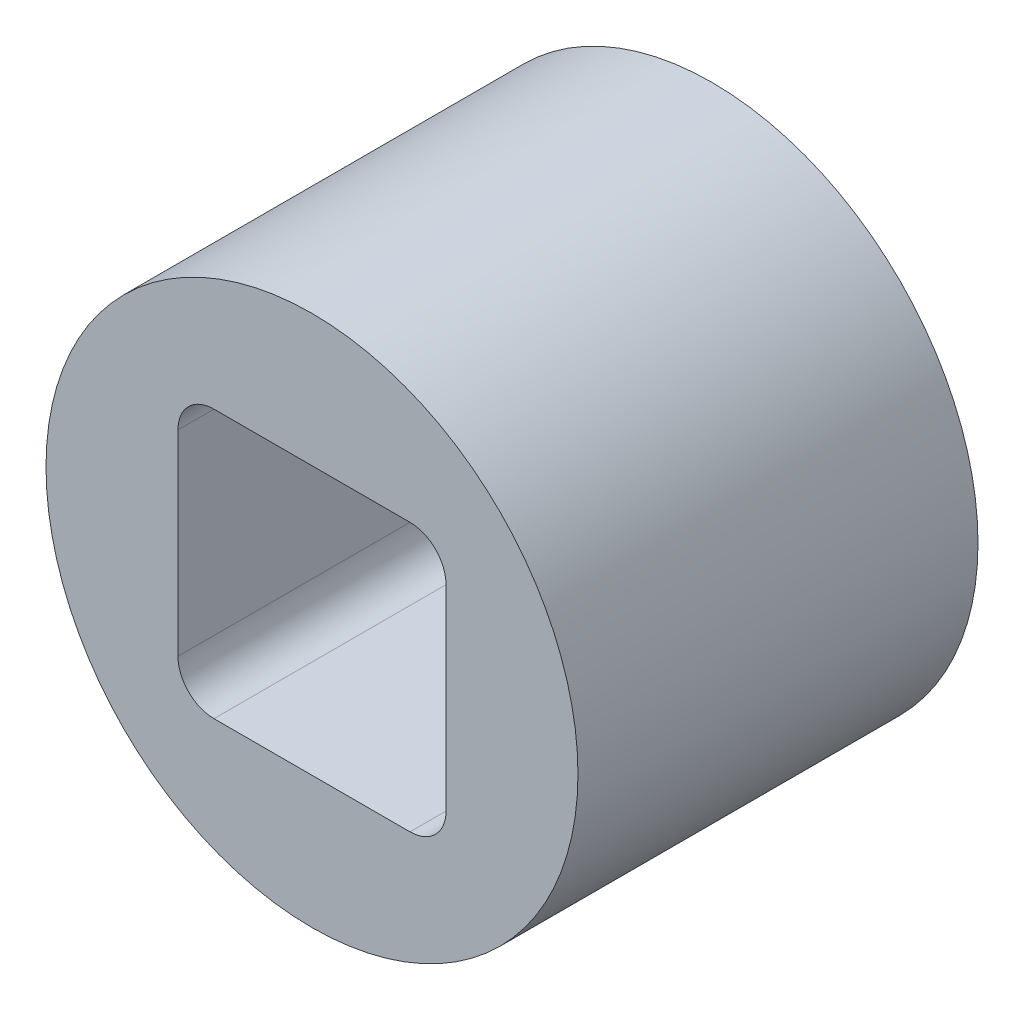
ISO-10303-21;
HEADER;
FILE_DESCRIPTION(('STEP AP214'),'2;1');
FILE_NAME('part.step','',(''),(''),'','','');
FILE_SCHEMA(('AUTOMOTIVE_DESIGN { 1 0 10303 214 1 1 1 1 }'));
ENDSEC;
DATA;
#1=APPLICATION_CONTEXT('core data for automotive mechanical design processes');
#2=APPLICATION_PROTOCOL_DEFINITION('international standard','automotive_design',2000,#1);
#3=PRODUCT_CONTEXT('',#1,'mechanical');
#4=PRODUCT('Part','Part','',(#3));
#5=PRODUCT_RELATED_PRODUCT_CATEGORY('part','',(#4));
#6=PRODUCT_DEFINITION_FORMATION('','',#4);
#7=PRODUCT_DEFINITION_CONTEXT('part definition',#1,'design');
#8=PRODUCT_DEFINITION('design','',#6,#7);
#9=PRODUCT_DEFINITION_SHAPE('','',#8);
#10=(LENGTH_UNIT() NAMED_UNIT(*) SI_UNIT(.MILLI.,.METRE.));
#11=(NAMED_UNIT(*) PLANE_ANGLE_UNIT() SI_UNIT($,.RADIAN.));
#12=(NAMED_UNIT(*) SI_UNIT($,.STERADIAN.) SOLID_ANGLE_UNIT());
#13=UNCERTAINTY_MEASURE_WITH_UNIT(LENGTH_MEASURE(1.E-05),#10,'distance_accuracy_value','');
#14=(GEOMETRIC_REPRESENTATION_CONTEXT(3) GLOBAL_UNCERTAINTY_ASSIGNED_CONTEXT((#13)) GLOBAL_UNIT_ASSIGNED_CONTEXT((#10,
#11,#12)) REPRESENTATION_CONTEXT('',''));
#15=CARTESIAN_POINT('',(0.,0.,0.));
#16=DIRECTION('',(0.,0.,1.));
#17=DIRECTION('',(1.,0.,0.));
#18=AXIS2_PLACEMENT_3D('',#15,#16,#17);
#19=CARTESIAN_POINT('',(0.,0.,4.7752));
#20=DIRECTION('',(0.,0.,1.));
#21=DIRECTION('',(1.,0.,0.));
#22=AXIS2_PLACEMENT_3D('',#19,#20,#21);
#23=PLANE('',#22);
#24=CARTESIAN_POINT('',(0.,0.,4.7752));
#25=DIRECTION('',(0.,0.,1.));
#26=DIRECTION('',(1.,0.,0.));
#27=AXIS2_PLACEMENT_3D('',#24,#25,#26);
#28=CIRCLE('',#27,3.175);
#29=CARTESIAN_POINT('',(3.175,0.,4.7752));
#30=VERTEX_POINT('',#29);
#31=EDGE_CURVE('E134',#30,#30,#28,.T.);
#32=ORIENTED_EDGE('',*,*,#31,.T.);
#33=EDGE_LOOP('',(#32));
#34=FACE_BOUND('',#33,.T.);
#35=DIRECTION('',(-1.,0.,0.));
#36=VECTOR('',#35,1.);
#37=CARTESIAN_POINT('',(-1.6,1.6,4.7752));
#38=LINE('',#37,#36);
#39=CARTESIAN_POINT('',(1.17,1.6,4.7752));
#40=VERTEX_POINT('',#39);
#41=CARTESIAN_POINT('',(-1.17,1.6,4.7752));
#42=VERTEX_POINT('',#41);
#43=EDGE_CURVE('E188',#40,#42,#38,.T.);
#44=ORIENTED_EDGE('',*,*,#43,.F.);
#45=CARTESIAN_POINT('',(1.17,1.17,4.7752));
#46=DIRECTION('',(0.,0.,1.));
#47=DIRECTION('',(1.,0.,0.));
#48=AXIS2_PLACEMENT_3D('',#45,#46,#47);
#49=CIRCLE('',#48,0.43);
#50=CARTESIAN_POINT('',(1.6,1.17,4.7752));
#51=VERTEX_POINT('',#50);
#52=EDGE_CURVE('E118',#40,#51,#49,.F.);
#53=ORIENTED_EDGE('',*,*,#52,.T.);
#54=DIRECTION('',(0.,1.,0.));
#55=VECTOR('',#54,1.);
#56=CARTESIAN_POINT('',(1.6,-1.6,4.7752));
#57=LINE('',#56,#55);
#58=CARTESIAN_POINT('',(1.6,-1.17,4.7752));
#59=VERTEX_POINT('',#58);
#60=EDGE_CURVE('E195',#59,#51,#57,.T.);
#61=ORIENTED_EDGE('',*,*,#60,.F.);
#62=CARTESIAN_POINT('',(1.17,-1.17,4.7752));
#63=DIRECTION('',(0.,0.,1.));
#64=DIRECTION('',(1.,0.,0.));
#65=AXIS2_PLACEMENT_3D('',#62,#63,#64);
#66=CIRCLE('',#65,0.43);
#67=CARTESIAN_POINT('',(1.17,-1.6,4.7752));
#68=VERTEX_POINT('',#67);
#69=EDGE_CURVE('E117',#59,#68,#66,.F.);
#70=ORIENTED_EDGE('',*,*,#69,.T.);
#71=DIRECTION('',(1.,0.,0.));
#72=VECTOR('',#71,1.);
#73=CARTESIAN_POINT('',(-1.6,-1.6,4.7752));
#74=LINE('',#73,#72);
#75=CARTESIAN_POINT('',(-1.17,-1.6,4.7752));
#76=VERTEX_POINT('',#75);
#77=EDGE_CURVE('E199',#76,#68,#74,.T.);
#78=ORIENTED_EDGE('',*,*,#77,.F.);
#79=CARTESIAN_POINT('',(-1.17,-1.17,4.7752));
#80=DIRECTION('',(0.,0.,1.));
#81=DIRECTION('',(1.,0.,0.));
#82=AXIS2_PLACEMENT_3D('',#79,#80,#81);
#83=CIRCLE('',#82,0.43);
#84=CARTESIAN_POINT('',(-1.6,-1.17,4.7752));
#85=VERTEX_POINT('',#84);
#86=EDGE_CURVE('E55',#76,#85,#83,.F.);
#87=ORIENTED_EDGE('',*,*,#86,.T.);
#88=DIRECTION('',(0.,-1.,0.));
#89=VECTOR('',#88,1.);
#90=CARTESIAN_POINT('',(-1.6,-1.6,4.7752));
#91=LINE('',#90,#89);
#92=CARTESIAN_POINT('',(-1.6,1.17,4.7752));
#93=VERTEX_POINT('',#92);
#94=EDGE_CURVE('E190',#93,#85,#91,.T.);
#95=ORIENTED_EDGE('',*,*,#94,.F.);
#96=CARTESIAN_POINT('',(-1.17,1.17,4.7752));
#97=DIRECTION('',(0.,0.,1.));
#98=DIRECTION('',(1.,0.,0.));
#99=AXIS2_PLACEMENT_3D('',#96,#97,#98);
#100=CIRCLE('',#99,0.43);
#101=EDGE_CURVE('E11',#93,#42,#100,.F.);
#102=ORIENTED_EDGE('',*,*,#101,.T.);
#103=EDGE_LOOP('',(#44,#53,#61,#70,#78,#87,#95,#102));
#104=FACE_BOUND('',#103,.T.);
#105=ADVANCED_FACE('F39',(#34,#104),#23,.T.);
#106=CARTESIAN_POINT('',(0.,0.,0.));
#107=DIRECTION('',(0.,0.,1.));
#108=DIRECTION('',(1.,0.,0.));
#109=AXIS2_PLACEMENT_3D('',#106,#107,#108);
#110=PLANE('',#109);
#111=CARTESIAN_POINT('',(0.,0.,0.));
#112=DIRECTION('',(0.,0.,1.));
#113=DIRECTION('',(1.,0.,0.));
#114=AXIS2_PLACEMENT_3D('',#111,#112,#113);
#115=CIRCLE('',#114,3.175);
#116=CARTESIAN_POINT('',(3.175,0.,0.));
#117=VERTEX_POINT('',#116);
#118=EDGE_CURVE('E141',#117,#117,#115,.T.);
#119=ORIENTED_EDGE('',*,*,#118,.F.);
#120=EDGE_LOOP('',(#119));
#121=FACE_BOUND('',#120,.T.);
#122=DIRECTION('',(1.,0.,0.));
#123=VECTOR('',#122,1.);
#124=CARTESIAN_POINT('',(-1.6,-1.6,0.));
#125=LINE('',#124,#123);
#126=CARTESIAN_POINT('',(-1.17,-1.6,0.));
#127=VERTEX_POINT('',#126);
#128=CARTESIAN_POINT('',(1.17,-1.6,0.));
#129=VERTEX_POINT('',#128);
#130=EDGE_CURVE('E111',#127,#129,#125,.T.);
#131=ORIENTED_EDGE('',*,*,#130,.T.);
#132=CARTESIAN_POINT('',(1.17,-1.17,0.));
#133=DIRECTION('',(0.,0.,1.));
#134=DIRECTION('',(1.,0.,0.));
#135=AXIS2_PLACEMENT_3D('',#132,#133,#134);
#136=CIRCLE('',#135,0.43);
#137=CARTESIAN_POINT('',(1.6,-1.17,0.));
#138=VERTEX_POINT('',#137);
#139=EDGE_CURVE('E106',#129,#138,#136,.T.);
#140=ORIENTED_EDGE('',*,*,#139,.T.);
#141=DIRECTION('',(0.,1.,0.));
#142=VECTOR('',#141,1.);
#143=CARTESIAN_POINT('',(1.6,-1.6,0.));
#144=LINE('',#143,#142);
#145=CARTESIAN_POINT('',(1.6,1.17,0.));
#146=VERTEX_POINT('',#145);
#147=EDGE_CURVE('E109',#138,#146,#144,.T.);
#148=ORIENTED_EDGE('',*,*,#147,.T.);
#149=CARTESIAN_POINT('',(1.17,1.17,0.));
#150=DIRECTION('',(0.,0.,1.));
#151=DIRECTION('',(1.,0.,0.));
#152=AXIS2_PLACEMENT_3D('',#149,#150,#151);
#153=CIRCLE('',#152,0.43);
#154=CARTESIAN_POINT('',(1.17,1.6,0.));
#155=VERTEX_POINT('',#154);
#156=EDGE_CURVE('E163',#146,#155,#153,.T.);
#157=ORIENTED_EDGE('',*,*,#156,.T.);
#158=DIRECTION('',(-1.,0.,0.));
#159=VECTOR('',#158,1.);
#160=CARTESIAN_POINT('',(-1.6,1.6,0.));
#161=LINE('',#160,#159);
#162=CARTESIAN_POINT('',(-1.17,1.6,0.));
#163=VERTEX_POINT('',#162);
#164=EDGE_CURVE('E129',#155,#163,#161,.T.);
#165=ORIENTED_EDGE('',*,*,#164,.T.);
#166=CARTESIAN_POINT('',(-1.17,1.17,0.));
#167=DIRECTION('',(0.,0.,1.));
#168=DIRECTION('',(1.,0.,0.));
#169=AXIS2_PLACEMENT_3D('',#166,#167,#168);
#170=CIRCLE('',#169,0.43);
#171=CARTESIAN_POINT('',(-1.6,1.17,0.));
#172=VERTEX_POINT('',#171);
#173=EDGE_CURVE('E48',#163,#172,#170,.T.);
#174=ORIENTED_EDGE('',*,*,#173,.T.);
#175=DIRECTION('',(0.,-1.,0.));
#176=VECTOR('',#175,1.);
#177=CARTESIAN_POINT('',(-1.6,-1.6,0.));
#178=LINE('',#177,#176);
#179=CARTESIAN_POINT('',(-1.6,-1.17,0.));
#180=VERTEX_POINT('',#179);
#181=EDGE_CURVE('E177',#172,#180,#178,.T.);
#182=ORIENTED_EDGE('',*,*,#181,.T.);
#183=CARTESIAN_POINT('',(-1.17,-1.17,0.));
#184=DIRECTION('',(0.,0.,1.));
#185=DIRECTION('',(1.,0.,0.));
#186=AXIS2_PLACEMENT_3D('',#183,#184,#185);
#187=CIRCLE('',#186,0.43);
#188=EDGE_CURVE('E170',#180,#127,#187,.T.);
#189=ORIENTED_EDGE('',*,*,#188,.T.);
#190=EDGE_LOOP('',(#131,#140,#148,#157,#165,#174,#182,#189));
#191=FACE_BOUND('',#190,.T.);
#192=ADVANCED_FACE('F108',(#121,#191),#110,.F.);
#193=CARTESIAN_POINT('',(0.,0.,4.7752));
#194=DIRECTION('',(0.,0.,-1.));
#195=DIRECTION('',(-1.,0.,0.));
#196=AXIS2_PLACEMENT_3D('',#193,#194,#195);
#197=CYLINDRICAL_SURFACE('',#196,3.175);
#198=ORIENTED_EDGE('',*,*,#31,.F.);
#199=EDGE_LOOP('',(#198));
#200=FACE_BOUND('',#199,.T.);
#201=ORIENTED_EDGE('',*,*,#118,.T.);
#202=EDGE_LOOP('',(#201));
#203=FACE_BOUND('',#202,.T.);
#204=ADVANCED_FACE('F214',(#200,#203),#197,.T.);
#205=CARTESIAN_POINT('',(1.6,-1.6,4.7752));
#206=DIRECTION('',(-1.,0.,0.));
#207=DIRECTION('',(0.,0.,1.));
#208=AXIS2_PLACEMENT_3D('',#205,#206,#207);
#209=PLANE('',#208);
#210=ORIENTED_EDGE('',*,*,#60,.T.);
#211=DIRECTION('',(0.,0.,-1.));
#212=VECTOR('',#211,1.);
#213=CARTESIAN_POINT('',(1.6,1.17,0.));
#214=LINE('',#213,#212);
#215=EDGE_CURVE('E127',#51,#146,#214,.T.);
#216=ORIENTED_EDGE('',*,*,#215,.T.);
#217=ORIENTED_EDGE('',*,*,#147,.F.);
#218=DIRECTION('',(0.,0.,-1.));
#219=VECTOR('',#218,1.);
#220=CARTESIAN_POINT('',(1.6,-1.17,4.7752));
#221=LINE('',#220,#219);
#222=EDGE_CURVE('E124',#138,#59,#221,.F.);
#223=ORIENTED_EDGE('',*,*,#222,.T.);
#224=EDGE_LOOP('',(#210,#216,#217,#223));
#225=FACE_BOUND('',#224,.T.);
#226=ADVANCED_FACE('F123',(#225),#209,.T.);
#227=CARTESIAN_POINT('',(-1.6,1.6,4.7752));
#228=DIRECTION('',(0.,-1.,0.));
#229=DIRECTION('',(0.,0.,-1.));
#230=AXIS2_PLACEMENT_3D('',#227,#228,#229);
#231=PLANE('',#230);
#232=ORIENTED_EDGE('',*,*,#164,.F.);
#233=DIRECTION('',(0.,0.,-1.));
#234=VECTOR('',#233,1.);
#235=CARTESIAN_POINT('',(1.17,1.6,4.7752));
#236=LINE('',#235,#234);
#237=EDGE_CURVE('E148',#155,#40,#236,.F.);
#238=ORIENTED_EDGE('',*,*,#237,.T.);
#239=ORIENTED_EDGE('',*,*,#43,.T.);
#240=DIRECTION('',(0.,0.,-1.));
#241=VECTOR('',#240,1.);
#242=CARTESIAN_POINT('',(-1.17,1.6,0.));
#243=LINE('',#242,#241);
#244=EDGE_CURVE('E138',#42,#163,#243,.T.);
#245=ORIENTED_EDGE('',*,*,#244,.T.);
#246=EDGE_LOOP('',(#232,#238,#239,#245));
#247=FACE_BOUND('',#246,.T.);
#248=ADVANCED_FACE('F192',(#247),#231,.T.);
#249=CARTESIAN_POINT('',(-1.6,-1.6,4.7752));
#250=DIRECTION('',(1.,0.,0.));
#251=DIRECTION('',(0.,0.,-1.));
#252=AXIS2_PLACEMENT_3D('',#249,#250,#251);
#253=PLANE('',#252);
#254=ORIENTED_EDGE('',*,*,#94,.T.);
#255=DIRECTION('',(0.,0.,-1.));
#256=VECTOR('',#255,1.);
#257=CARTESIAN_POINT('',(-1.6,-1.17,0.));
#258=LINE('',#257,#256);
#259=EDGE_CURVE('E159',#85,#180,#258,.T.);
#260=ORIENTED_EDGE('',*,*,#259,.T.);
#261=ORIENTED_EDGE('',*,*,#181,.F.);
#262=DIRECTION('',(0.,0.,-1.));
#263=VECTOR('',#262,1.);
#264=CARTESIAN_POINT('',(-1.6,1.17,4.7752));
#265=LINE('',#264,#263);
#266=EDGE_CURVE('E62',#172,#93,#265,.F.);
#267=ORIENTED_EDGE('',*,*,#266,.T.);
#268=EDGE_LOOP('',(#254,#260,#261,#267));
#269=FACE_BOUND('',#268,.T.);
#270=ADVANCED_FACE('F181',(#269),#253,.T.);
#271=CARTESIAN_POINT('',(-1.6,-1.6,4.7752));
#272=DIRECTION('',(0.,1.,0.));
#273=DIRECTION('',(0.,0.,1.));
#274=AXIS2_PLACEMENT_3D('',#271,#272,#273);
#275=PLANE('',#274);
#276=ORIENTED_EDGE('',*,*,#77,.T.);
#277=DIRECTION('',(0.,0.,-1.));
#278=VECTOR('',#277,1.);
#279=CARTESIAN_POINT('',(1.17,-1.6,0.));
#280=LINE('',#279,#278);
#281=EDGE_CURVE('E154',#68,#129,#280,.T.);
#282=ORIENTED_EDGE('',*,*,#281,.T.);
#283=ORIENTED_EDGE('',*,*,#130,.F.);
#284=DIRECTION('',(0.,0.,-1.));
#285=VECTOR('',#284,1.);
#286=CARTESIAN_POINT('',(-1.17,-1.6,4.7752));
#287=LINE('',#286,#285);
#288=EDGE_CURVE('E151',#127,#76,#287,.F.);
#289=ORIENTED_EDGE('',*,*,#288,.T.);
#290=EDGE_LOOP('',(#276,#282,#283,#289));
#291=FACE_BOUND('',#290,.T.);
#292=ADVANCED_FACE('F231',(#291),#275,.T.);
#293=CARTESIAN_POINT('',(1.17,1.17,4.7752));
#294=DIRECTION('',(0.,0.,1.));
#295=DIRECTION('',(1.,0.,0.));
#296=AXIS2_PLACEMENT_3D('',#293,#294,#295);
#297=CYLINDRICAL_SURFACE('',#296,0.43);
#298=ORIENTED_EDGE('',*,*,#52,.F.);
#299=ORIENTED_EDGE('',*,*,#237,.F.);
#300=ORIENTED_EDGE('',*,*,#156,.F.);
#301=ORIENTED_EDGE('',*,*,#215,.F.);
#302=EDGE_LOOP('',(#298,#299,#300,#301));
#303=FACE_BOUND('',#302,.T.);
#304=ADVANCED_FACE('F228',(#303),#297,.F.);
#305=CARTESIAN_POINT('',(1.17,-1.17,4.7752));
#306=DIRECTION('',(0.,0.,1.));
#307=DIRECTION('',(1.,0.,0.));
#308=AXIS2_PLACEMENT_3D('',#305,#306,#307);
#309=CYLINDRICAL_SURFACE('',#308,0.43);
#310=ORIENTED_EDGE('',*,*,#69,.F.);
#311=ORIENTED_EDGE('',*,*,#222,.F.);
#312=ORIENTED_EDGE('',*,*,#139,.F.);
#313=ORIENTED_EDGE('',*,*,#281,.F.);
#314=EDGE_LOOP('',(#310,#311,#312,#313));
#315=FACE_BOUND('',#314,.T.);
#316=ADVANCED_FACE('F132',(#315),#309,.F.);
#317=CARTESIAN_POINT('',(-1.17,-1.17,4.7752));
#318=DIRECTION('',(0.,0.,1.));
#319=DIRECTION('',(1.,0.,0.));
#320=AXIS2_PLACEMENT_3D('',#317,#318,#319);
#321=CYLINDRICAL_SURFACE('',#320,0.43);
#322=ORIENTED_EDGE('',*,*,#86,.F.);
#323=ORIENTED_EDGE('',*,*,#288,.F.);
#324=ORIENTED_EDGE('',*,*,#188,.F.);
#325=ORIENTED_EDGE('',*,*,#259,.F.);
#326=EDGE_LOOP('',(#322,#323,#324,#325));
#327=FACE_BOUND('',#326,.T.);
#328=ADVANCED_FACE('F234',(#327),#321,.F.);
#329=CARTESIAN_POINT('',(-1.17,1.17,4.7752));
#330=DIRECTION('',(0.,0.,1.));
#331=DIRECTION('',(1.,0.,0.));
#332=AXIS2_PLACEMENT_3D('',#329,#330,#331);
#333=CYLINDRICAL_SURFACE('',#332,0.43);
#334=ORIENTED_EDGE('',*,*,#101,.F.);
#335=ORIENTED_EDGE('',*,*,#266,.F.);
#336=ORIENTED_EDGE('',*,*,#173,.F.);
#337=ORIENTED_EDGE('',*,*,#244,.F.);
#338=EDGE_LOOP('',(#334,#335,#336,#337));
#339=FACE_BOUND('',#338,.T.);
#340=ADVANCED_FACE('F41',(#339),#333,.F.);
#341=CLOSED_SHELL('',(#105,#192,#204,#226,#248,#270,#292,#304,#316,#328,#340));
#342=MANIFOLD_SOLID_BREP('B2',#341);
#343=ADVANCED_BREP_SHAPE_REPRESENTATION('',(#18,#342),#14);
#344=SHAPE_DEFINITION_REPRESENTATION(#9,#343);
ENDSEC;
END-ISO-10303-21;
